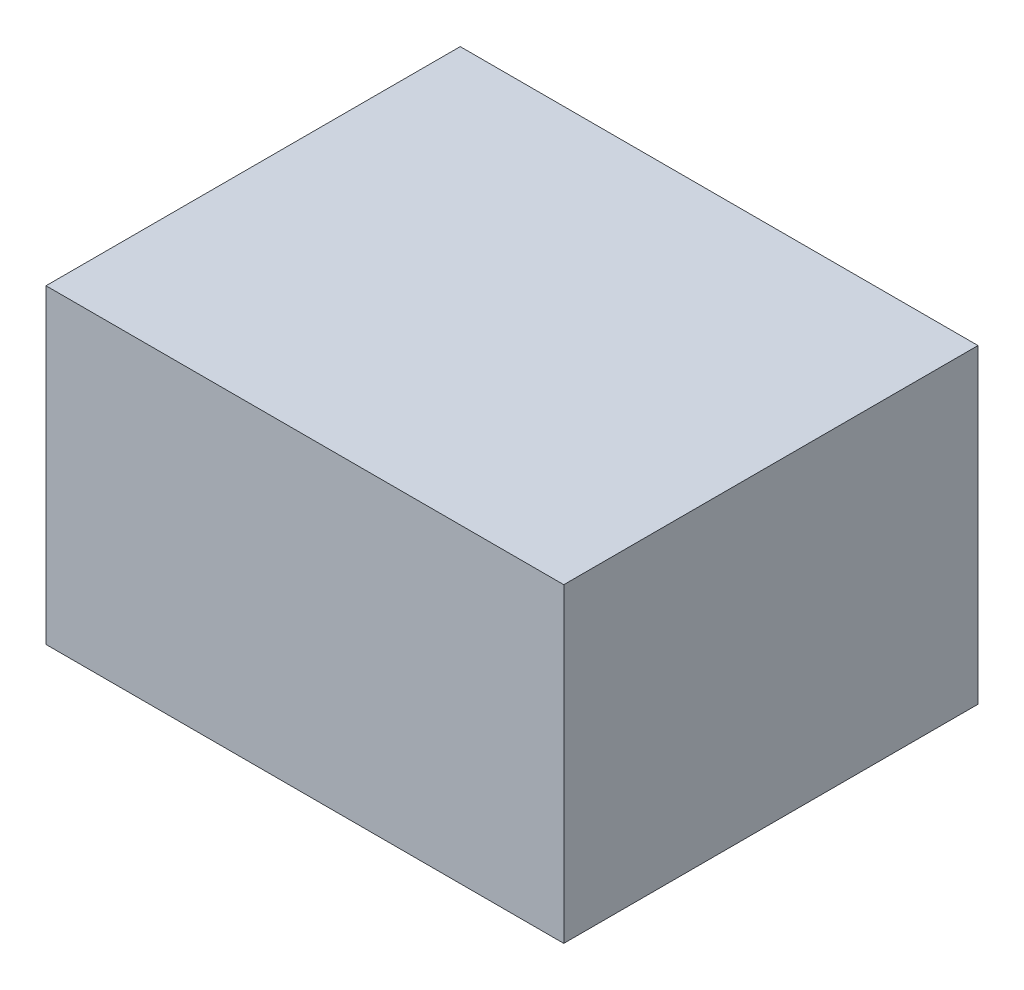
ISO-10303-21;
HEADER;
FILE_DESCRIPTION(('STEP AP214'),'2;1');
FILE_NAME('part.step','',(''),(''),'','','');
FILE_SCHEMA(('AUTOMOTIVE_DESIGN { 1 0 10303 214 1 1 1 1 }'));
ENDSEC;
DATA;
#1=APPLICATION_CONTEXT('core data for automotive mechanical design processes');
#2=APPLICATION_PROTOCOL_DEFINITION('international standard','automotive_design',2000,#1);
#3=PRODUCT_CONTEXT('',#1,'mechanical');
#4=PRODUCT('Part','Part','',(#3));
#5=PRODUCT_RELATED_PRODUCT_CATEGORY('part','',(#4));
#6=PRODUCT_DEFINITION_FORMATION('','',#4);
#7=PRODUCT_DEFINITION_CONTEXT('part definition',#1,'design');
#8=PRODUCT_DEFINITION('design','',#6,#7);
#9=PRODUCT_DEFINITION_SHAPE('','',#8);
#10=(LENGTH_UNIT() NAMED_UNIT(*) SI_UNIT(.MILLI.,.METRE.));
#11=(NAMED_UNIT(*) PLANE_ANGLE_UNIT() SI_UNIT($,.RADIAN.));
#12=(NAMED_UNIT(*) SI_UNIT($,.STERADIAN.) SOLID_ANGLE_UNIT());
#13=UNCERTAINTY_MEASURE_WITH_UNIT(LENGTH_MEASURE(1.E-05),#10,'distance_accuracy_value','');
#14=(GEOMETRIC_REPRESENTATION_CONTEXT(3) GLOBAL_UNCERTAINTY_ASSIGNED_CONTEXT((#13)) GLOBAL_UNIT_ASSIGNED_CONTEXT((#10,
#11,#12)) REPRESENTATION_CONTEXT('',''));
#15=CARTESIAN_POINT('',(0.,0.,0.));
#16=DIRECTION('',(0.,0.,1.));
#17=DIRECTION('',(1.,0.,0.));
#18=AXIS2_PLACEMENT_3D('',#15,#16,#17);
#19=CARTESIAN_POINT('',(-100.,150.,-200.));
#20=DIRECTION('',(1.,0.,0.));
#21=DIRECTION('',(0.,0.,-1.));
#22=AXIS2_PLACEMENT_3D('',#19,#20,#21);
#23=PLANE('',#22);
#24=DIRECTION('',(0.,0.,1.));
#25=VECTOR('',#24,1.);
#26=CARTESIAN_POINT('',(-100.,0.,-200.));
#27=LINE('',#26,#25);
#28=CARTESIAN_POINT('',(-100.,0.,-200.));
#29=VERTEX_POINT('',#28);
#30=CARTESIAN_POINT('',(-100.,0.,0.));
#31=VERTEX_POINT('',#30);
#32=EDGE_CURVE('E98',#29,#31,#27,.T.);
#33=ORIENTED_EDGE('',*,*,#32,.T.);
#34=DIRECTION('',(0.,-1.,0.));
#35=VECTOR('',#34,1.);
#36=CARTESIAN_POINT('',(-100.,150.,0.));
#37=LINE('',#36,#35);
#38=CARTESIAN_POINT('',(-100.,150.,0.));
#39=VERTEX_POINT('',#38);
#40=EDGE_CURVE('E11',#39,#31,#37,.T.);
#41=ORIENTED_EDGE('',*,*,#40,.F.);
#42=DIRECTION('',(0.,0.,1.));
#43=VECTOR('',#42,1.);
#44=CARTESIAN_POINT('',(-100.,150.,-200.));
#45=LINE('',#44,#43);
#46=CARTESIAN_POINT('',(-100.,150.,-200.));
#47=VERTEX_POINT('',#46);
#48=EDGE_CURVE('E86',#47,#39,#45,.T.);
#49=ORIENTED_EDGE('',*,*,#48,.F.);
#50=DIRECTION('',(0.,-1.,0.));
#51=VECTOR('',#50,1.);
#52=CARTESIAN_POINT('',(-100.,150.,-200.));
#53=LINE('',#52,#51);
#54=EDGE_CURVE('E94',#47,#29,#53,.T.);
#55=ORIENTED_EDGE('',*,*,#54,.T.);
#56=EDGE_LOOP('',(#33,#41,#49,#55));
#57=FACE_BOUND('',#56,.T.);
#58=ADVANCED_FACE('F35',(#57),#23,.F.);
#59=CARTESIAN_POINT('',(-100.,150.,0.));
#60=DIRECTION('',(0.,0.,-1.));
#61=DIRECTION('',(-1.,0.,0.));
#62=AXIS2_PLACEMENT_3D('',#59,#60,#61);
#63=PLANE('',#62);
#64=DIRECTION('',(1.,0.,0.));
#65=VECTOR('',#64,1.);
#66=CARTESIAN_POINT('',(-100.,0.,0.));
#67=LINE('',#66,#65);
#68=CARTESIAN_POINT('',(150.,0.,0.));
#69=VERTEX_POINT('',#68);
#70=EDGE_CURVE('E90',#31,#69,#67,.T.);
#71=ORIENTED_EDGE('',*,*,#70,.T.);
#72=DIRECTION('',(0.,-1.,0.));
#73=VECTOR('',#72,1.);
#74=CARTESIAN_POINT('',(150.,150.,0.));
#75=LINE('',#74,#73);
#76=CARTESIAN_POINT('',(150.,150.,0.));
#77=VERTEX_POINT('',#76);
#78=EDGE_CURVE('E43',#77,#69,#75,.T.);
#79=ORIENTED_EDGE('',*,*,#78,.F.);
#80=DIRECTION('',(1.,0.,0.));
#81=VECTOR('',#80,1.);
#82=CARTESIAN_POINT('',(-100.,150.,0.));
#83=LINE('',#82,#81);
#84=EDGE_CURVE('E81',#39,#77,#83,.T.);
#85=ORIENTED_EDGE('',*,*,#84,.F.);
#86=ORIENTED_EDGE('',*,*,#40,.T.);
#87=EDGE_LOOP('',(#71,#79,#85,#86));
#88=FACE_BOUND('',#87,.T.);
#89=ADVANCED_FACE('F89',(#88),#63,.F.);
#90=CARTESIAN_POINT('',(150.,150.,-200.));
#91=DIRECTION('',(-1.,0.,0.));
#92=DIRECTION('',(0.,0.,1.));
#93=AXIS2_PLACEMENT_3D('',#90,#91,#92);
#94=PLANE('',#93);
#95=DIRECTION('',(0.,0.,-1.));
#96=VECTOR('',#95,1.);
#97=CARTESIAN_POINT('',(150.,0.,-200.));
#98=LINE('',#97,#96);
#99=CARTESIAN_POINT('',(150.,0.,-200.));
#100=VERTEX_POINT('',#99);
#101=EDGE_CURVE('E68',#69,#100,#98,.T.);
#102=ORIENTED_EDGE('',*,*,#101,.T.);
#103=DIRECTION('',(0.,-1.,0.));
#104=VECTOR('',#103,1.);
#105=CARTESIAN_POINT('',(150.,150.,-200.));
#106=LINE('',#105,#104);
#107=CARTESIAN_POINT('',(150.,150.,-200.));
#108=VERTEX_POINT('',#107);
#109=EDGE_CURVE('E91',#108,#100,#106,.T.);
#110=ORIENTED_EDGE('',*,*,#109,.F.);
#111=DIRECTION('',(0.,0.,-1.));
#112=VECTOR('',#111,1.);
#113=CARTESIAN_POINT('',(150.,150.,-200.));
#114=LINE('',#113,#112);
#115=EDGE_CURVE('E84',#77,#108,#114,.T.);
#116=ORIENTED_EDGE('',*,*,#115,.F.);
#117=ORIENTED_EDGE('',*,*,#78,.T.);
#118=EDGE_LOOP('',(#102,#110,#116,#117));
#119=FACE_BOUND('',#118,.T.);
#120=ADVANCED_FACE('F92',(#119),#94,.F.);
#121=CARTESIAN_POINT('',(-100.,150.,-200.));
#122=DIRECTION('',(0.,0.,1.));
#123=DIRECTION('',(1.,0.,0.));
#124=AXIS2_PLACEMENT_3D('',#121,#122,#123);
#125=PLANE('',#124);
#126=DIRECTION('',(-1.,0.,0.));
#127=VECTOR('',#126,1.);
#128=CARTESIAN_POINT('',(-100.,0.,-200.));
#129=LINE('',#128,#127);
#130=EDGE_CURVE('E74',#100,#29,#129,.T.);
#131=ORIENTED_EDGE('',*,*,#130,.T.);
#132=ORIENTED_EDGE('',*,*,#54,.F.);
#133=DIRECTION('',(-1.,0.,0.));
#134=VECTOR('',#133,1.);
#135=CARTESIAN_POINT('',(-100.,150.,-200.));
#136=LINE('',#135,#134);
#137=EDGE_CURVE('E51',#108,#47,#136,.T.);
#138=ORIENTED_EDGE('',*,*,#137,.F.);
#139=ORIENTED_EDGE('',*,*,#109,.T.);
#140=EDGE_LOOP('',(#131,#132,#138,#139));
#141=FACE_BOUND('',#140,.T.);
#142=ADVANCED_FACE('F105',(#141),#125,.F.);
#143=CARTESIAN_POINT('',(0.,150.,0.));
#144=DIRECTION('',(0.,1.,0.));
#145=DIRECTION('',(0.,0.,1.));
#146=AXIS2_PLACEMENT_3D('',#143,#144,#145);
#147=PLANE('',#146);
#148=ORIENTED_EDGE('',*,*,#48,.T.);
#149=ORIENTED_EDGE('',*,*,#84,.T.);
#150=ORIENTED_EDGE('',*,*,#115,.T.);
#151=ORIENTED_EDGE('',*,*,#137,.T.);
#152=EDGE_LOOP('',(#148,#149,#150,#151));
#153=FACE_BOUND('',#152,.T.);
#154=ADVANCED_FACE('F82',(#153),#147,.T.);
#155=CARTESIAN_POINT('',(0.,0.,0.));
#156=DIRECTION('',(0.,1.,0.));
#157=DIRECTION('',(0.,0.,1.));
#158=AXIS2_PLACEMENT_3D('',#155,#156,#157);
#159=PLANE('',#158);
#160=ORIENTED_EDGE('',*,*,#32,.F.);
#161=ORIENTED_EDGE('',*,*,#130,.F.);
#162=ORIENTED_EDGE('',*,*,#101,.F.);
#163=ORIENTED_EDGE('',*,*,#70,.F.);
#164=EDGE_LOOP('',(#160,#161,#162,#163));
#165=FACE_BOUND('',#164,.T.);
#166=ADVANCED_FACE('F108',(#165),#159,.F.);
#167=CLOSED_SHELL('',(#58,#89,#120,#142,#154,#166));
#168=MANIFOLD_SOLID_BREP('B2',#167);
#169=ADVANCED_BREP_SHAPE_REPRESENTATION('',(#18,#168),#14);
#170=SHAPE_DEFINITION_REPRESENTATION(#9,#169);
ENDSEC;
END-ISO-10303-21;
